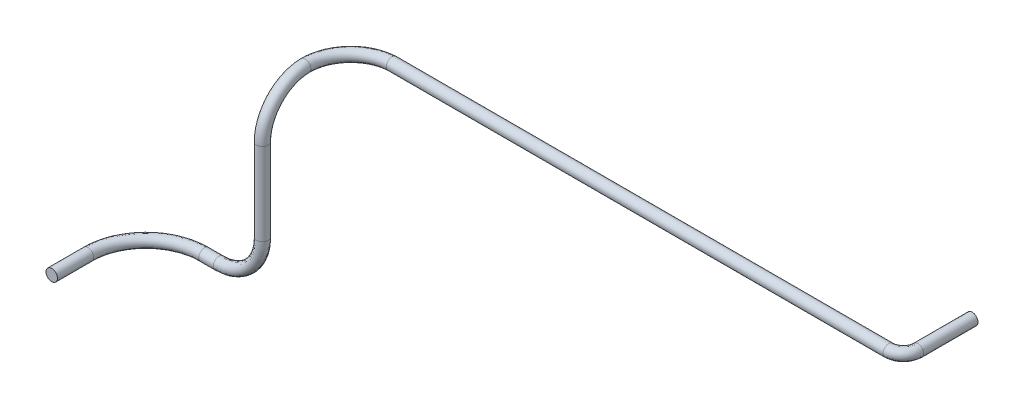
ISO-10303-21;
HEADER;
FILE_DESCRIPTION(('STEP AP214'),'2;1');
FILE_NAME('part.step','',(''),(''),'','','');
FILE_SCHEMA(('AUTOMOTIVE_DESIGN { 1 0 10303 214 1 1 1 1 }'));
ENDSEC;
DATA;
#1=APPLICATION_CONTEXT('core data for automotive mechanical design processes');
#2=APPLICATION_PROTOCOL_DEFINITION('international standard','automotive_design',2000,#1);
#3=PRODUCT_CONTEXT('',#1,'mechanical');
#4=PRODUCT('Part','Part','',(#3));
#5=PRODUCT_RELATED_PRODUCT_CATEGORY('part','',(#4));
#6=PRODUCT_DEFINITION_FORMATION('','',#4);
#7=PRODUCT_DEFINITION_CONTEXT('part definition',#1,'design');
#8=PRODUCT_DEFINITION('design','',#6,#7);
#9=PRODUCT_DEFINITION_SHAPE('','',#8);
#10=(LENGTH_UNIT() NAMED_UNIT(*) SI_UNIT(.MILLI.,.METRE.));
#11=(NAMED_UNIT(*) PLANE_ANGLE_UNIT() SI_UNIT($,.RADIAN.));
#12=(NAMED_UNIT(*) SI_UNIT($,.STERADIAN.) SOLID_ANGLE_UNIT());
#13=UNCERTAINTY_MEASURE_WITH_UNIT(LENGTH_MEASURE(1.E-05),#10,'distance_accuracy_value','');
#14=(GEOMETRIC_REPRESENTATION_CONTEXT(3) GLOBAL_UNCERTAINTY_ASSIGNED_CONTEXT((#13)) GLOBAL_UNIT_ASSIGNED_CONTEXT((#10,
#11,#12)) REPRESENTATION_CONTEXT('',''));
#15=CARTESIAN_POINT('',(0.,0.,0.));
#16=DIRECTION('',(0.,0.,1.));
#17=DIRECTION('',(1.,0.,0.));
#18=AXIS2_PLACEMENT_3D('',#15,#16,#17);
#19=CARTESIAN_POINT('',(15.9022776834919,17.4631518272913,-18.9967218608217));
#20=DIRECTION('',(-0.99953155694736,0.,0.030605010478455));
#21=DIRECTION('',(0.030605010478455,0.,0.99953155694736));
#22=AXIS2_PLACEMENT_3D('',#19,#20,#21);
#23=TOROIDAL_SURFACE('',#22,6.00000000000001,0.793750000000001);
#24=CARTESIAN_POINT('',(16.0859077463626,17.4631518272913,-12.9995325191375));
#25=DIRECTION('',(0.,-1.,0.));
#26=DIRECTION('',(0.,0.,-1.));
#27=AXIS2_PLACEMENT_3D('',#24,#25,#26);
#28=CIRCLE('',#27,0.793750000000001);
#29=CARTESIAN_POINT('',(16.1102004734299,17.4631518272913,-12.2061543458105));
#30=VERTEX_POINT('',#29);
#31=EDGE_CURVE('E85',#30,#30,#28,.T.);
#32=CARTESIAN_POINT('',(15.9003874911531,23.4628339516931,-19.0584538080351));
#33=DIRECTION('',(0.030603389047452,0.010293479778,0.999478602498758));
#34=DIRECTION('',(0.0309055582558082,-0.999478602498758,0.00934717155222445));
#35=AXIS2_PLACEMENT_3D('',#32,#33,#34);
#36=CIRCLE('',#35,0.793750000000001);
#37=CARTESIAN_POINT('',(15.9001374344583,24.2565418994004,-19.0666204302186));
#38=VERTEX_POINT('',#37);
#39=EDGE_CURVE('E91',#38,#38,#36,.T.);
#40=CARTESIAN_POINT('',(15.9022776834919,17.4631518272913,-18.9967218608217));
#41=DIRECTION('',(-0.99953155694736,0.,0.030605010478455));
#42=DIRECTION('',(0.030605010478455,0.,0.99953155694736));
#43=AXIS2_PLACEMENT_3D('',#40,#41,#42);
#44=CIRCLE('',#43,6.79375000000001);
#45=EDGE_CURVE('',#30,#38,#44,.T.);
#46=ORIENTED_EDGE('',*,*,#31,.F.);
#47=ORIENTED_EDGE('',*,*,#39,.T.);
#48=ORIENTED_EDGE('',*,*,#45,.T.);
#49=ORIENTED_EDGE('',*,*,#45,.F.);
#50=EDGE_LOOP('',(#46,#48,#47,#49));
#51=FACE_BOUND('',#50,.T.);
#52=ADVANCED_FACE('F56',(#51),#23,.T.);
#53=CARTESIAN_POINT('',(0.,0.,-5.));
#54=DIRECTION('',(0.,0.,1.));
#55=DIRECTION('',(1.,0.,0.));
#56=AXIS2_PLACEMENT_3D('',#53,#54,#55);
#57=CYLINDRICAL_SURFACE('',#56,0.79375);
#58=CARTESIAN_POINT('',(0.,0.,-5.));
#59=DIRECTION('',(0.,0.,1.));
#60=DIRECTION('',(1.,0.,0.));
#61=AXIS2_PLACEMENT_3D('',#58,#59,#60);
#62=CIRCLE('',#61,0.79375);
#63=CARTESIAN_POINT('',(0.79375,0.,-5.));
#64=VERTEX_POINT('',#63);
#65=EDGE_CURVE('E62',#64,#64,#62,.T.);
#66=ORIENTED_EDGE('',*,*,#65,.T.);
#67=EDGE_LOOP('',(#66));
#68=FACE_BOUND('',#67,.T.);
#69=CARTESIAN_POINT('',(0.,0.,0.));
#70=DIRECTION('',(0.,0.,1.));
#71=DIRECTION('',(1.,0.,0.));
#72=AXIS2_PLACEMENT_3D('',#69,#70,#71);
#73=CIRCLE('',#72,0.79375);
#74=CARTESIAN_POINT('',(0.79375,0.,0.));
#75=VERTEX_POINT('',#74);
#76=EDGE_CURVE('E11',#75,#75,#73,.T.);
#77=ORIENTED_EDGE('',*,*,#76,.F.);
#78=EDGE_LOOP('',(#77));
#79=FACE_BOUND('',#78,.T.);
#80=ADVANCED_FACE('F133',(#68,#79),#57,.T.);
#81=CARTESIAN_POINT('',(0.,0.,0.));
#82=DIRECTION('',(0.,0.,1.));
#83=DIRECTION('',(1.,0.,0.));
#84=AXIS2_PLACEMENT_3D('',#81,#82,#83);
#85=PLANE('',#84);
#86=ORIENTED_EDGE('',*,*,#76,.T.);
#87=EDGE_LOOP('',(#86));
#88=FACE_BOUND('',#87,.T.);
#89=ADVANCED_FACE('F138',(#88),#85,.T.);
#90=CARTESIAN_POINT('',(0.79375,0.,-5.));
#91=CARTESIAN_POINT('',(0.79375,0.,-5.55121069612661));
#92=CARTESIAN_POINT('',(0.902461399918087,0.,-6.49882307808425));
#93=CARTESIAN_POINT('',(1.39506992977593,0.,-8.04076592704354));
#94=CARTESIAN_POINT('',(2.25416291161361,0.,-9.45003486522962));
#95=CARTESIAN_POINT('',(3.34030220407969,0.,-10.5658813927915));
#96=CARTESIAN_POINT('',(4.53595519879204,0.,-11.3600749672463));
#97=CARTESIAN_POINT('',(5.69563502094855,0.,-11.868927939888));
#98=CARTESIAN_POINT('',(6.91816345637884,0.,-12.1531709526249));
#99=CARTESIAN_POINT('',(7.65213138085307,0.,-12.2104319743187));
#100=CARTESIAN_POINT('',(8.08219341902237,0.,-12.2057825191375));
#101=CARTESIAN_POINT('',(0.79375,1.5875,-5.));
#102=CARTESIAN_POINT('',(0.79375,1.5875,-5.71449258598961));
#103=CARTESIAN_POINT('',(0.902496126286649,1.5875,-6.41809205464769));
#104=CARTESIAN_POINT('',(1.3949375966712,1.5875,-8.06402991573264));
#105=CARTESIAN_POINT('',(2.25467999570539,1.5875,-9.44353085862261));
#106=CARTESIAN_POINT('',(3.33852722584472,1.5875,-10.5672313499232));
#107=CARTESIAN_POINT('',(4.54092750105634,1.5875,-11.3597110150834));
#108=CARTESIAN_POINT('',(5.67775924166376,1.5875,-11.8692002777266));
#109=CARTESIAN_POINT('',(6.98062988843737,1.5875,-12.1524746335504));
#110=CARTESIAN_POINT('',(7.5244577637847,1.5875,-12.2118122699684));
#111=CARTESIAN_POINT('',(8.08219341902237,1.5875,-12.2057825191375));
#112=CARTESIAN_POINT('',(-0.79375,1.5875,-5.));
#113=CARTESIAN_POINT('',(-0.79375,1.5875,-5.71449258598961));
#114=CARTESIAN_POINT('',(-0.662564314717088,1.5875,-6.8045773817789));
#115=CARTESIAN_POINT('',(-0.0579898858309135,1.5875,-8.71966285098736));
#116=CARTESIAN_POINT('',(0.981500020508139,1.5875,-10.420512623199));
#117=CARTESIAN_POINT('',(2.31565136931301,1.5875,-11.7941163644912));
#118=CARTESIAN_POINT('',(3.76356797342369,1.5875,-12.7554732375633));
#119=CARTESIAN_POINT('',(5.18003171816228,1.5875,-13.3812237438058));
#120=CARTESIAN_POINT('',(6.68622652073018,1.5875,-13.7270839899256));
#121=CARTESIAN_POINT('',(7.53303884486578,1.5875,-13.7993122699684));
#122=CARTESIAN_POINT('',(8.09077450010345,1.5875,-13.7932825191375));
#123=CARTESIAN_POINT('',(-0.79375,0.,-5.));
#124=CARTESIAN_POINT('',(-0.793750000000001,0.,-5.63285164105811));
#125=CARTESIAN_POINT('',(-0.662581677901369,0.,-6.84494289349718));
#126=CARTESIAN_POINT('',(-0.0579237192785501,0.,-8.70803085664281));
#127=CARTESIAN_POINT('',(0.98124147846225,0.,-10.4237646265025));
#128=CARTESIAN_POINT('',(2.3165388584305,0.,-11.7934413859254));
#129=CARTESIAN_POINT('',(3.76108182229154,0.,-12.7556552136447));
#130=CARTESIAN_POINT('',(5.18896960780467,0.,-13.3810875748865));
#131=CARTESIAN_POINT('',(6.65499330470092,0.,-13.7274321494628));
#132=CARTESIAN_POINT('',(7.59687565339997,0.,-13.7986221221436));
#133=CARTESIAN_POINT('',(8.09077450010345,0.,-13.7932825191375));
#134=CARTESIAN_POINT('',(-0.793750000000001,-1.5875,-5.));
#135=CARTESIAN_POINT('',(-0.793750000000001,-1.5875,-5.55121069612661));
#136=CARTESIAN_POINT('',(-0.662599041085649,-1.5875,-6.88530840521546));
#137=CARTESIAN_POINT('',(-0.0578575527261866,-1.5875,-8.69639886229826));
#138=CARTESIAN_POINT('',(0.98098293641636,-1.5875,-10.427016629806));
#139=CARTESIAN_POINT('',(2.31742634754798,-1.5875,-11.7927664073595));
#140=CARTESIAN_POINT('',(3.75859567115939,-1.5875,-12.7558371897261));
#141=CARTESIAN_POINT('',(5.19790749744705,-1.5875,-13.3809514059672));
#142=CARTESIAN_POINT('',(6.62376008867166,-1.5875,-13.7277803090001));
#143=CARTESIAN_POINT('',(7.66071246193416,-1.5875,-13.7979319743187));
#144=CARTESIAN_POINT('',(8.09077450010345,-1.5875,-13.7932825191375));
#145=CARTESIAN_POINT('',(0.79375,-1.5875,-5.));
#146=CARTESIAN_POINT('',(0.79375,-1.5875,-5.38792880626362));
#147=CARTESIAN_POINT('',(0.902426673549526,-1.5875,-6.5795541015208));
#148=CARTESIAN_POINT('',(1.39520226288065,-1.5875,-8.01750193835444));
#149=CARTESIAN_POINT('',(2.25364582752183,-1.5875,-9.45653887183662));
#150=CARTESIAN_POINT('',(3.34207718231467,-1.5875,-10.5645314356599));
#151=CARTESIAN_POINT('',(4.53098289652774,-1.5875,-11.3604389194091));
#152=CARTESIAN_POINT('',(5.71351080023332,-1.5875,-11.8686556020494));
#153=CARTESIAN_POINT('',(6.85569702432032,-1.5875,-12.1538672716995));
#154=CARTESIAN_POINT('',(7.77980499792145,-1.5875,-12.209051678669));
#155=CARTESIAN_POINT('',(8.08219341902237,-1.5875,-12.2057825191375));
#156=CARTESIAN_POINT('',(0.79375,0.,-5.));
#157=CARTESIAN_POINT('',(0.79375,0.,-5.55121069612661));
#158=CARTESIAN_POINT('',(0.902461399918087,0.,-6.49882307808425));
#159=CARTESIAN_POINT('',(1.39506992977593,0.,-8.04076592704354));
#160=CARTESIAN_POINT('',(2.25416291161361,0.,-9.45003486522962));
#161=CARTESIAN_POINT('',(3.34030220407969,0.,-10.5658813927915));
#162=CARTESIAN_POINT('',(4.53595519879204,0.,-11.3600749672463));
#163=CARTESIAN_POINT('',(5.69563502094855,0.,-11.868927939888));
#164=CARTESIAN_POINT('',(6.91816345637884,0.,-12.1531709526249));
#165=CARTESIAN_POINT('',(7.65213138085307,0.,-12.2104319743187));
#166=CARTESIAN_POINT('',(8.08219341902237,0.,-12.2057825191375));
#167=(BOUNDED_SURFACE() B_SPLINE_SURFACE(3,3,((#90,#91,#92,#93,#94,#95,#96,#97,#98,#99,#100),
(#101,#102,#103,#104,#105,#106,#107,#108,#109,#110,#111),(#112,#113,#114,#115,#116,#117,#118,
#119,#120,#121,#122),(#123,#124,#125,#126,#127,#128,#129,#130,#131,#132,#133),(#134,#135,#136,
#137,#138,#139,#140,#141,#142,#143,#144),(#145,#146,#147,#148,#149,#150,#151,#152,#153,#154,
#155),(#156,#157,#158,#159,#160,#161,#162,#163,#164,#165,#166)),.UNSPECIFIED.,.T.,.F.,
.F.) B_SPLINE_SURFACE_WITH_KNOTS((4,3,4),(4,1,1,1,1,1,1,1,4),(0.,0.5,1.),(0.,0.130931855275869,
0.270275933054755,0.415607398335897,0.563033208375599,0.678069485534592,0.790201692771163,
0.897842426149174,1.),
.UNSPECIFIED.) GEOMETRIC_REPRESENTATION_ITEM() RATIONAL_B_SPLINE_SURFACE(((1.,1.,1.,1.,1.,1.,1.,
1.,1.,1.,1.),(0.333333333333333,0.333333333333333,0.333333333333333,0.333333333333333,
0.333333333333333,0.333333333333334,0.333333333333333,0.333333333333333,0.333333333333333,
0.333333333333333,0.333333333333333),(0.333333333333333,0.333333333333333,0.333333333333333,
0.333333333333333,0.333333333333333,0.333333333333334,0.333333333333333,0.333333333333333,
0.333333333333333,0.333333333333333,0.333333333333333),(1.,1.,1.,1.,1.,1.,1.,1.,1.,1.,1.),
(0.333333333333333,0.333333333333333,0.333333333333333,0.333333333333333,0.333333333333333,
0.333333333333334,0.333333333333333,0.333333333333333,0.333333333333333,0.333333333333333,
0.333333333333333),(0.333333333333333,0.333333333333333,0.333333333333333,0.333333333333333,
0.333333333333333,0.333333333333334,0.333333333333333,0.333333333333333,0.333333333333333,
0.333333333333333,0.333333333333333),(1.,1.,1.,1.,1.,1.,1.,1.,1.,1.,1.))) REPRESENTATION_ITEM('') SURFACE());
#168=CARTESIAN_POINT('',(8.08219341902237,0.,-12.2057825191375));
#169=CARTESIAN_POINT('',(8.08219341902237,1.5875,-12.2057825191375));
#170=CARTESIAN_POINT('',(8.09077450010345,1.5875,-13.7932825191375));
#171=CARTESIAN_POINT('',(8.09077450010345,0.,-13.7932825191375));
#172=CARTESIAN_POINT('',(8.09077450010345,-1.5875,-13.7932825191375));
#173=CARTESIAN_POINT('',(8.08219341902237,-1.5875,-12.2057825191375));
#174=CARTESIAN_POINT('',(8.08219341902237,0.,-12.2057825191375));
#175=(BOUNDED_CURVE() B_SPLINE_CURVE(3,(#168,#169,#170,#171,#172,#173,#174),.UNSPECIFIED.,.T.,
.F.) B_SPLINE_CURVE_WITH_KNOTS((4,3,4),(0.,0.5,1.),
.UNSPECIFIED.) CURVE() GEOMETRIC_REPRESENTATION_ITEM() RATIONAL_B_SPLINE_CURVE((1.,
0.333333333333333,0.333333333333333,1.,0.333333333333333,0.333333333333333,1.)) REPRESENTATION_ITEM(''));
#176=CARTESIAN_POINT('',(8.08219341902237,0.,-12.2057825191375));
#177=VERTEX_POINT('',#176);
#178=EDGE_CURVE('E66',#177,#177,#175,.F.);
#179=ORIENTED_EDGE('',*,*,#65,.F.);
#180=EDGE_LOOP('',(#179));
#181=FACE_BOUND('',#180,.T.);
#182=ORIENTED_EDGE('',*,*,#178,.F.);
#183=EDGE_LOOP('',(#182));
#184=FACE_BOUND('',#183,.T.);
#185=ADVANCED_FACE('F201',(#181,#184),#167,.F.);
#186=CARTESIAN_POINT('',(8.08219341902237,0.,-12.2057825191375));
#187=CARTESIAN_POINT('',(10.0864839595629,0.,-12.2057825191375));
#188=CARTESIAN_POINT('',(8.08219341902237,-1.5875,-12.2057825191375));
#189=CARTESIAN_POINT('',(10.0864839595629,-1.5875,-12.2057825191375));
#190=CARTESIAN_POINT('',(8.09077450010345,-1.5875,-13.7932825191375));
#191=CARTESIAN_POINT('',(10.0864839595629,-1.5875,-13.7932825191375));
#192=CARTESIAN_POINT('',(8.09077450010345,0.,-13.7932825191375));
#193=CARTESIAN_POINT('',(10.0864839595629,0.,-13.7932825191375));
#194=CARTESIAN_POINT('',(8.09077450010345,1.5875,-13.7932825191375));
#195=CARTESIAN_POINT('',(10.0864839595629,1.5875,-13.7932825191375));
#196=CARTESIAN_POINT('',(8.08219341902237,1.5875,-12.2057825191375));
#197=CARTESIAN_POINT('',(10.0864839595629,1.5875,-12.2057825191375));
#198=CARTESIAN_POINT('',(8.08219341902237,0.,-12.2057825191375));
#199=CARTESIAN_POINT('',(10.0864839595629,0.,-12.2057825191375));
#200=(BOUNDED_SURFACE() B_SPLINE_SURFACE(3,1,((#186,#187),(#188,#189),(#190,#191),(#192,#193),
(#194,#195),(#196,#197),(#198,#199)),.UNSPECIFIED.,.T.,.F.,.F.) B_SPLINE_SURFACE_WITH_KNOTS((4,
3,4),(2,2),(0.,0.5,1.),(0.,1.),
.UNSPECIFIED.) GEOMETRIC_REPRESENTATION_ITEM() RATIONAL_B_SPLINE_SURFACE(((1.,1.),
(0.333333333333333,0.333333333333333),(0.333333333333333,0.333333333333333),(1.,1.),
(0.333333333333333,0.333333333333333),(0.333333333333333,0.333333333333333),(1.,1.))) REPRESENTATION_ITEM('') SURFACE());
#201=CARTESIAN_POINT('',(10.0864839595629,0.,-12.9995325191375));
#202=DIRECTION('',(-1.,0.,0.));
#203=DIRECTION('',(0.,0.,1.));
#204=AXIS2_PLACEMENT_3D('',#201,#202,#203);
#205=CIRCLE('',#204,0.793750000000001);
#206=CARTESIAN_POINT('',(10.0864839595629,0.,-12.2057825191375));
#207=VERTEX_POINT('',#206);
#208=EDGE_CURVE('E70',#207,#207,#205,.T.);
#209=ORIENTED_EDGE('',*,*,#178,.T.);
#210=EDGE_LOOP('',(#209));
#211=FACE_BOUND('',#210,.T.);
#212=ORIENTED_EDGE('',*,*,#208,.T.);
#213=EDGE_LOOP('',(#212));
#214=FACE_BOUND('',#213,.T.);
#215=ADVANCED_FACE('F190',(#211,#214),#200,.T.);
#216=CARTESIAN_POINT('',(10.0864839595629,0.,-12.2057825191375));
#217=CARTESIAN_POINT('',(10.4156071673363,0.,-12.2057825191375));
#218=CARTESIAN_POINT('',(11.092904952409,0.0572010557845806,-12.2057825191375));
#219=CARTESIAN_POINT('',(12.1035801235411,0.315056429532537,-12.2057825191375));
#220=CARTESIAN_POINT('',(13.0899866308757,0.76888029284049,-12.2057825191375));
#221=CARTESIAN_POINT('',(14.0011565230001,1.40742482158729,-12.2057825191375));
#222=CARTESIAN_POINT('',(14.7787276954148,2.20690643633673,-12.2057825191375));
#223=CARTESIAN_POINT('',(15.386385076463,3.12183933203862,-12.2057825191375));
#224=CARTESIAN_POINT('',(15.8099007232931,4.09892911030999,-12.2057825191375));
#225=CARTESIAN_POINT('',(16.0444876780903,5.09479114986662,-12.2057825191375));
#226=CARTESIAN_POINT('',(16.0903853294223,5.7600931623081,-12.2057825191375));
#227=CARTESIAN_POINT('',(16.0859077463626,6.08315182729134,-12.2057825191375));
#228=CARTESIAN_POINT('',(10.0864839595629,1.5875,-12.2057825191375));
#229=CARTESIAN_POINT('',(10.4156071673363,1.5875,-12.2057825191375));
#230=CARTESIAN_POINT('',(10.7840771907375,1.62961991510903,-12.2057825191375));
#231=CARTESIAN_POINT('',(11.5873219733214,1.82111491024618,-12.2057825191374));
#232=CARTESIAN_POINT('',(12.2904850075255,2.15222558219324,-12.2057825191375));
#233=CARTESIAN_POINT('',(12.9752077745897,2.63047691940933,-12.2057825191374));
#234=CARTESIAN_POINT('',(13.5364207042263,3.20910700574488,-12.2057825191375));
#235=CARTESIAN_POINT('',(13.99030672049,3.89816121286266,-12.2057825191375));
#236=CARTESIAN_POINT('',(14.2971994566224,4.59493017412421,-12.2057825191374));
#237=CARTESIAN_POINT('',(14.4694720208952,5.38712763926278,-12.2057825191375));
#238=CARTESIAN_POINT('',(14.5028853294223,5.74909234025445,-12.2057825191375));
#239=CARTESIAN_POINT('',(14.4984077463626,6.07215100523768,-12.2057825191375));
#240=CARTESIAN_POINT('',(10.0864839595629,1.5875,-13.7932825191375));
#241=CARTESIAN_POINT('',(10.4156071673363,1.5875,-13.7932825191375));
#242=CARTESIAN_POINT('',(10.7840771907375,1.629619915109,-13.7932825191375));
#243=CARTESIAN_POINT('',(11.5873219733213,1.82111491024629,-13.7932825191374));
#244=CARTESIAN_POINT('',(12.2904850075255,2.1522255821932,-13.7932825191375));
#245=CARTESIAN_POINT('',(12.9752077745897,2.63047691940937,-13.7932825191374));
#246=CARTESIAN_POINT('',(13.5364207042263,3.20910700574487,-13.7932825191375));
#247=CARTESIAN_POINT('',(13.99030672049,3.89816121286266,-13.7932825191375));
#248=CARTESIAN_POINT('',(14.2971994566223,4.59493017412423,-13.7932825191374));
#249=CARTESIAN_POINT('',(14.4694720208952,5.38712763926278,-13.7932825191375));
#250=CARTESIAN_POINT('',(14.5028853294223,5.74909234025445,-13.7932825191375));
#251=CARTESIAN_POINT('',(14.4984077463626,6.07215100523768,-13.7932825191375));
#252=CARTESIAN_POINT('',(10.0864839595629,0.,-13.7932825191375));
#253=CARTESIAN_POINT('',(10.4156071673363,0.,-13.7932825191375));
#254=CARTESIAN_POINT('',(11.092904952409,0.0572010557845516,-13.7932825191375));
#255=CARTESIAN_POINT('',(12.103580123541,0.315056429532647,-13.7932825191375));
#256=CARTESIAN_POINT('',(13.0899866308757,0.768880292840451,-13.7932825191375));
#257=CARTESIAN_POINT('',(14.0011565230001,1.40742482158733,-13.7932825191375));
#258=CARTESIAN_POINT('',(14.7787276954148,2.20690643633672,-13.7932825191375));
#259=CARTESIAN_POINT('',(15.386385076463,3.12183933203862,-13.7932825191375));
#260=CARTESIAN_POINT('',(15.8099007232931,4.09892911031001,-13.7932825191375));
#261=CARTESIAN_POINT('',(16.0444876780904,5.09479114986661,-13.7932825191375));
#262=CARTESIAN_POINT('',(16.0903853294223,5.7600931623081,-13.7932825191375));
#263=CARTESIAN_POINT('',(16.0859077463626,6.08315182729134,-13.7932825191375));
#264=CARTESIAN_POINT('',(10.0864839595629,-1.5875,-13.7932825191375));
#265=CARTESIAN_POINT('',(10.4156071673363,-1.5875,-13.7932825191375));
#266=CARTESIAN_POINT('',(11.4017327140805,-1.5152178035399,-13.7932825191375));
#267=CARTESIAN_POINT('',(12.6198382737607,-1.191002051181,-13.7932825191376));
#268=CARTESIAN_POINT('',(13.8894882542258,-0.614464996512293,-13.7932825191375));
#269=CARTESIAN_POINT('',(15.0271052714105,0.184372723765301,-13.7932825191375));
#270=CARTESIAN_POINT('',(16.0210346866033,1.20470586692857,-13.7932825191375));
#271=CARTESIAN_POINT('',(16.782463432436,2.34551745121458,-13.7932825191375));
#272=CARTESIAN_POINT('',(17.3226019899638,3.60292804649579,-13.7932825191376));
#273=CARTESIAN_POINT('',(17.6195033352855,4.80245466047045,-13.7932825191375));
#274=CARTESIAN_POINT('',(17.6778853294223,5.77109398436176,-13.7932825191375));
#275=CARTESIAN_POINT('',(17.6734077463626,6.09415264934499,-13.7932825191375));
#276=CARTESIAN_POINT('',(10.0864839595629,-1.5875,-12.2057825191375));
#277=CARTESIAN_POINT('',(10.4156071673363,-1.5875,-12.2057825191375));
#278=CARTESIAN_POINT('',(11.4017327140805,-1.51521780353987,-12.2057825191375));
#279=CARTESIAN_POINT('',(12.6198382737608,-1.19100205118111,-12.2057825191376));
#280=CARTESIAN_POINT('',(13.8894882542258,-0.614464996512254,-12.2057825191374));
#281=CARTESIAN_POINT('',(15.0271052714106,0.184372723765259,-12.2057825191375));
#282=CARTESIAN_POINT('',(16.0210346866033,1.20470586692857,-12.2057825191375));
#283=CARTESIAN_POINT('',(16.782463432436,2.34551745121458,-12.2057825191375));
#284=CARTESIAN_POINT('',(17.3226019899639,3.60292804649577,-12.2057825191376));
#285=CARTESIAN_POINT('',(17.6195033352855,4.80245466047045,-12.2057825191375));
#286=CARTESIAN_POINT('',(17.6778853294223,5.77109398436176,-12.2057825191375));
#287=CARTESIAN_POINT('',(17.6734077463626,6.09415264934499,-12.2057825191375));
#288=CARTESIAN_POINT('',(10.0864839595629,0.,-12.2057825191375));
#289=CARTESIAN_POINT('',(10.4156071673363,0.,-12.2057825191375));
#290=CARTESIAN_POINT('',(11.092904952409,0.0572010557845806,-12.2057825191375));
#291=CARTESIAN_POINT('',(12.1035801235411,0.315056429532537,-12.2057825191375));
#292=CARTESIAN_POINT('',(13.0899866308757,0.76888029284049,-12.2057825191375));
#293=CARTESIAN_POINT('',(14.0011565230001,1.40742482158729,-12.2057825191375));
#294=CARTESIAN_POINT('',(14.7787276954148,2.20690643633673,-12.2057825191375));
#295=CARTESIAN_POINT('',(15.386385076463,3.12183933203862,-12.2057825191375));
#296=CARTESIAN_POINT('',(15.8099007232931,4.09892911030999,-12.2057825191375));
#297=CARTESIAN_POINT('',(16.0444876780903,5.09479114986662,-12.2057825191375));
#298=CARTESIAN_POINT('',(16.0903853294223,5.7600931623081,-12.2057825191375));
#299=CARTESIAN_POINT('',(16.0859077463626,6.08315182729134,-12.2057825191375));
#300=(BOUNDED_SURFACE() B_SPLINE_SURFACE(3,3,((#216,#217,#218,#219,#220,#221,#222,#223,#224,
#225,#226,#227),(#228,#229,#230,#231,#232,#233,#234,#235,#236,#237,#238,#239),(#240,#241,#242,
#243,#244,#245,#246,#247,#248,#249,#250,#251),(#252,#253,#254,#255,#256,#257,#258,#259,#260,
#261,#262,#263),(#264,#265,#266,#267,#268,#269,#270,#271,#272,#273,#274,#275),(#276,#277,#278,
#279,#280,#281,#282,#283,#284,#285,#286,#287),(#288,#289,#290,#291,#292,#293,#294,#295,#296,
#297,#298,#299)),.UNSPECIFIED.,.T.,.F.,.F.) B_SPLINE_SURFACE_WITH_KNOTS((4,3,4),(4,1,1,1,1,1,1,
1,1,4),(0.,0.5,1.),(0.,0.103991589107504,0.213654385410186,0.327971845338527,0.445153856531877,
0.563248175135867,0.678229257362202,0.790339538006728,0.897914717250648,1.),
.UNSPECIFIED.) GEOMETRIC_REPRESENTATION_ITEM() RATIONAL_B_SPLINE_SURFACE(((1.,1.,1.,1.,1.,1.,1.,
1.,1.,1.,1.,1.),(0.333333333333333,0.333333333333333,0.333333333333333,0.333333333333333,
0.333333333333333,0.333333333333333,0.333333333333333,0.333333333333333,0.333333333333333,
0.333333333333333,0.333333333333333,0.333333333333333),(0.333333333333333,0.333333333333333,
0.333333333333333,0.333333333333333,0.333333333333333,0.333333333333333,0.333333333333333,
0.333333333333333,0.333333333333333,0.333333333333333,0.333333333333333,0.333333333333333),(1.,
1.,1.,1.,1.,1.,1.,1.,1.,1.,1.,1.),(0.333333333333333,0.333333333333333,0.333333333333333,
0.333333333333333,0.333333333333333,0.333333333333333,0.333333333333333,0.333333333333333,
0.333333333333333,0.333333333333333,0.333333333333333,0.333333333333333),(0.333333333333333,
0.333333333333333,0.333333333333333,0.333333333333333,0.333333333333333,0.333333333333333,
0.333333333333333,0.333333333333333,0.333333333333333,0.333333333333333,0.333333333333333,
0.333333333333333),(1.,1.,1.,1.,1.,1.,1.,1.,1.,1.,1.,1.))) REPRESENTATION_ITEM('') SURFACE());
#301=CARTESIAN_POINT('',(16.0859077463626,6.08315182729134,-12.2057825191375));
#302=CARTESIAN_POINT('',(14.4984077463626,6.07215100523768,-12.2057825191375));
#303=CARTESIAN_POINT('',(14.4984077463626,6.07215100523768,-13.7932825191375));
#304=CARTESIAN_POINT('',(16.0859077463626,6.08315182729134,-13.7932825191375));
#305=CARTESIAN_POINT('',(17.6734077463626,6.09415264934499,-13.7932825191375));
#306=CARTESIAN_POINT('',(17.6734077463626,6.09415264934499,-12.2057825191375));
#307=CARTESIAN_POINT('',(16.0859077463626,6.08315182729134,-12.2057825191375));
#308=(BOUNDED_CURVE() B_SPLINE_CURVE(3,(#301,#302,#303,#304,#305,#306,#307),.UNSPECIFIED.,.T.,
.F.) B_SPLINE_CURVE_WITH_KNOTS((4,3,4),(0.,0.5,1.),
.UNSPECIFIED.) CURVE() GEOMETRIC_REPRESENTATION_ITEM() RATIONAL_B_SPLINE_CURVE((1.,
0.333333333333333,0.333333333333333,1.,0.333333333333333,0.333333333333333,1.)) REPRESENTATION_ITEM(''));
#309=CARTESIAN_POINT('',(16.0859077463626,6.08315182729134,-12.2057825191375));
#310=VERTEX_POINT('',#309);
#311=EDGE_CURVE('E80',#310,#310,#308,.F.);
#312=ORIENTED_EDGE('',*,*,#208,.F.);
#313=EDGE_LOOP('',(#312));
#314=FACE_BOUND('',#313,.T.);
#315=ORIENTED_EDGE('',*,*,#311,.F.);
#316=EDGE_LOOP('',(#315));
#317=FACE_BOUND('',#316,.T.);
#318=ADVANCED_FACE('F179',(#314,#317),#300,.F.);
#319=CARTESIAN_POINT('',(16.0859077463626,6.08315182729134,-12.2057825191375));
#320=CARTESIAN_POINT('',(16.0859077463626,17.4631518272913,-12.2057825191375));
#321=CARTESIAN_POINT('',(17.6734077463626,6.09415264934499,-12.2057825191375));
#322=CARTESIAN_POINT('',(17.6734077463626,17.4631518272913,-12.2057825191375));
#323=CARTESIAN_POINT('',(17.6734077463626,6.09415264934499,-13.7932825191375));
#324=CARTESIAN_POINT('',(17.6734077463626,17.4631518272913,-13.7932825191375));
#325=CARTESIAN_POINT('',(16.0859077463626,6.08315182729134,-13.7932825191375));
#326=CARTESIAN_POINT('',(16.0859077463626,17.4631518272913,-13.7932825191375));
#327=CARTESIAN_POINT('',(14.4984077463626,6.07215100523768,-13.7932825191375));
#328=CARTESIAN_POINT('',(14.4984077463626,17.4631518272913,-13.7932825191375));
#329=CARTESIAN_POINT('',(14.4984077463626,6.07215100523768,-12.2057825191375));
#330=CARTESIAN_POINT('',(14.4984077463626,17.4631518272913,-12.2057825191375));
#331=CARTESIAN_POINT('',(16.0859077463626,6.08315182729134,-12.2057825191375));
#332=CARTESIAN_POINT('',(16.0859077463626,17.4631518272913,-12.2057825191375));
#333=(BOUNDED_SURFACE() B_SPLINE_SURFACE(3,1,((#319,#320),(#321,#322),(#323,#324),(#325,#326),
(#327,#328),(#329,#330),(#331,#332)),.UNSPECIFIED.,.T.,.F.,.F.) B_SPLINE_SURFACE_WITH_KNOTS((4,
3,4),(2,2),(0.,0.5,1.),(0.,1.),
.UNSPECIFIED.) GEOMETRIC_REPRESENTATION_ITEM() RATIONAL_B_SPLINE_SURFACE(((1.,1.),
(0.333333333333333,0.333333333333333),(0.333333333333333,0.333333333333333),(1.,1.),
(0.333333333333333,0.333333333333333),(0.333333333333333,0.333333333333333),(1.,1.))) REPRESENTATION_ITEM('') SURFACE());
#334=ORIENTED_EDGE('',*,*,#311,.T.);
#335=EDGE_LOOP('',(#334));
#336=FACE_BOUND('',#335,.T.);
#337=ORIENTED_EDGE('',*,*,#31,.T.);
#338=EDGE_LOOP('',(#337));
#339=FACE_BOUND('',#338,.T.);
#340=ADVANCED_FACE('F146',(#336,#339),#333,.T.);
#341=CARTESIAN_POINT('',(15.9249187780186,22.6694978109597,-19.0510344906155));
#342=CARTESIAN_POINT('',(15.9123074001239,22.6652559616949,-19.4629105195837));
#343=CARTESIAN_POINT('',(15.9753648527662,22.6587873584817,-20.3155489036407));
#344=CARTESIAN_POINT('',(16.3441238672302,22.6563448642548,-21.5787863486613));
#345=CARTESIAN_POINT('',(17.0128990089931,22.6623397432432,-22.7729946284047));
#346=CARTESIAN_POINT('',(17.8831822038274,22.6758310091782,-23.7283696901541));
#347=CARTESIAN_POINT('',(18.8427184898837,22.6941602165956,-24.418291105192));
#348=CARTESIAN_POINT('',(19.7949138855259,22.7145061436134,-24.8759996034077));
#349=CARTESIAN_POINT('',(20.7735976102355,22.7373060538036,-25.1478024916096));
#350=CARTESIAN_POINT('',(21.4305643035122,22.7536474466346,-25.2212200850917));
#351=CARTESIAN_POINT('',(21.751904748704,22.761902570363,-25.2295548289814));
#352=CARTESIAN_POINT('',(17.5109165137102,22.7180806910726,-19.1000970643466));
#353=CARTESIAN_POINT('',(17.4982408737101,22.7138172271859,-19.5140718347032));
#354=CARTESIAN_POINT('',(17.5504975583229,22.7108057612913,-19.9735081460467));
#355=CARTESIAN_POINT('',(17.8140071658628,22.7082225066481,-20.9643533241682));
#356=CARTESIAN_POINT('',(18.3105636736513,22.7128762160697,-21.8297218311341));
#357=CARTESIAN_POINT('',(18.936244355476,22.722466890822,-22.5280174500001));
#358=CARTESIAN_POINT('',(19.652016637039,22.7361544255634,-23.0411175211869));
#359=CARTESIAN_POINT('',(20.3248039596233,22.7504272860977,-23.3753385916913));
#360=CARTESIAN_POINT('',(21.1006846028789,22.7686111536952,-23.579396660874));
#361=CARTESIAN_POINT('',(21.448917140074,22.7771254639618,-23.633844540326));
#362=CARTESIAN_POINT('',(21.7721813598536,22.7854300087871,-23.642229181976));
#363=CARTESIAN_POINT('',(17.4618539399791,24.3047529725393,-19.1149356991858));
#364=CARTESIAN_POINT('',(17.4491782999791,24.3004895086526,-19.5289104695424));
#365=CARTESIAN_POINT('',(17.5017714311548,24.297438767623,-19.9933970476155));
#366=CARTESIAN_POINT('',(17.7673891458188,24.2948815021371,-20.9872604254181));
#367=CARTESIAN_POINT('',(18.2673673675154,24.2995914864803,-21.8560452692922));
#368=CARTESIAN_POINT('',(18.8971769094143,24.3092751944357,-22.5558194877683));
#369=CARTESIAN_POINT('',(19.6178144953243,24.3230798316654,-23.0698753924479));
#370=CARTESIAN_POINT('',(20.2955599608483,24.3374890227194,-23.4032826296241));
#371=CARTESIAN_POINT('',(21.0751250144523,24.3557775742385,-23.6063807107368));
#372=CARTESIAN_POINT('',(21.4282299891206,24.3644511109672,-23.65737197875));
#373=CARTESIAN_POINT('',(21.7514942089003,24.3727556557925,-23.6657566204));
#374=CARTESIAN_POINT('',(15.8758562042875,24.2561700924265,-19.0658731254547));
#375=CARTESIAN_POINT('',(15.8632126953401,24.2519174358507,-19.478798525117));
#376=CARTESIAN_POINT('',(15.9266548687423,24.2454257133144,-20.3349191345295));
#377=CARTESIAN_POINT('',(16.2975002783868,24.2430022961522,-21.6018427611028));
#378=CARTESIAN_POINT('',(16.9697078706481,24.249055543247,-22.7992764492167));
#379=CARTESIAN_POINT('',(17.8441011400095,24.2626388817208,-23.7561799216141));
#380=CARTESIAN_POINT('',(18.8085538167884,24.2810866041976,-24.4470479551322));
#381=CARTESIAN_POINT('',(19.7655352947615,24.3015644177828,-24.9039406586626));
#382=CARTESIAN_POINT('',(20.7485084187863,24.3244845599637,-25.1747986073956));
#383=CARTESIAN_POINT('',(21.4089152652649,24.3409483830916,-25.2447225746356));
#384=CARTESIAN_POINT('',(21.7312175977506,24.3492282173685,-25.2530822674054));
#385=CARTESIAN_POINT('',(14.289858468596,24.2075872123137,-19.0168105517236));
#386=CARTESIAN_POINT('',(14.2772470907012,24.2033453630488,-19.4286865806917));
#387=CARTESIAN_POINT('',(14.3515383063298,24.1934126590057,-20.6764412214435));
#388=CARTESIAN_POINT('',(14.8276114109547,24.1911230901674,-22.2164250967874));
#389=CARTESIAN_POINT('',(15.6720483737807,24.1985196000136,-23.7425076291413));
#390=CARTESIAN_POINT('',(16.7910253706047,24.2160025690058,-24.9565403554599));
#391=CARTESIAN_POINT('',(17.9992931382524,24.2390933767299,-25.8242205178166));
#392=CARTESIAN_POINT('',(19.2355106286748,24.2656398128462,-26.4045986877012));
#393=CARTESIAN_POINT('',(20.4218918231202,24.2931915456888,-26.7432165040544));
#394=CARTESIAN_POINT('',(21.3896005414092,24.317445655216,-26.8320731705211));
#395=CARTESIAN_POINT('',(21.710940986601,24.3257007789445,-26.8404079144109));
#396=CARTESIAN_POINT('',(14.3389210423271,22.6209149308469,-19.0019719168845));
#397=CARTESIAN_POINT('',(14.3263739265376,22.6166946962039,-19.4117492044641));
#398=CARTESIAN_POINT('',(14.4002321472095,22.6067689556721,-20.6575896612348));
#399=CARTESIAN_POINT('',(14.8742405685976,22.6044672218614,-22.1932193731544));
#400=CARTESIAN_POINT('',(15.7152343443349,22.6118032704167,-23.7162674256753));
#401=CARTESIAN_POINT('',(16.8301200521787,22.6291951275343,-24.928721930308));
#402=CARTESIAN_POINT('',(18.0334203427284,22.6521660076277,-25.7954646891972));
#403=CARTESIAN_POINT('',(19.2650238114286,22.6785850011291,-26.3766606151241));
#404=CARTESIAN_POINT('',(20.446510617592,22.7060009539121,-26.7162083223451));
#405=CARTESIAN_POINT('',(21.4122114669504,22.7301694293074,-26.8085956298574));
#406=CARTESIAN_POINT('',(21.7316281375544,22.738375131939,-26.8168804759869));
#407=CARTESIAN_POINT('',(15.9249187780186,22.6694978109597,-19.0510344906155));
#408=CARTESIAN_POINT('',(15.9123074001239,22.6652559616949,-19.4629105195837));
#409=CARTESIAN_POINT('',(15.9753648527662,22.6587873584817,-20.3155489036407));
#410=CARTESIAN_POINT('',(16.3441238672302,22.6563448642548,-21.5787863486613));
#411=CARTESIAN_POINT('',(17.0128990089931,22.6623397432432,-22.7729946284047));
#412=CARTESIAN_POINT('',(17.8831822038274,22.6758310091782,-23.7283696901541));
#413=CARTESIAN_POINT('',(18.8427184898837,22.6941602165956,-24.418291105192));
#414=CARTESIAN_POINT('',(19.7949138855259,22.7145061436134,-24.8759996034077));
#415=CARTESIAN_POINT('',(20.7735976102355,22.7373060538036,-25.1478024916096));
#416=CARTESIAN_POINT('',(21.4305643035122,22.7536474466346,-25.2212200850917));
#417=CARTESIAN_POINT('',(21.751904748704,22.761902570363,-25.2295548289814));
#418=(BOUNDED_SURFACE() B_SPLINE_SURFACE(3,3,((#341,#342,#343,#344,#345,#346,#347,#348,#349,
#350,#351),(#352,#353,#354,#355,#356,#357,#358,#359,#360,#361,#362),(#363,#364,#365,#366,#367,
#368,#369,#370,#371,#372,#373),(#374,#375,#376,#377,#378,#379,#380,#381,#382,#383,#384),(#385,
#386,#387,#388,#389,#390,#391,#392,#393,#394,#395),(#396,#397,#398,#399,#400,#401,#402,#403,
#404,#405,#406),(#407,#408,#409,#410,#411,#412,#413,#414,#415,#416,#417)),.UNSPECIFIED.,.T.,.F.,
.F.) B_SPLINE_SURFACE_WITH_KNOTS((4,3,4),(4,1,1,1,1,1,1,1,4),(0.,0.5,1.),(0.,0.130996990791339,
0.270366826360009,0.415637501797421,0.563035931322771,0.678005537451252,0.790138104229313,
0.897787039621126,1.),
.UNSPECIFIED.) GEOMETRIC_REPRESENTATION_ITEM() RATIONAL_B_SPLINE_SURFACE(((1.,1.,1.,1.,1.,1.,1.,
1.,1.,1.,1.),(0.333333333333333,0.333333333333333,0.333333333333333,0.333333333333333,
0.333333333333333,0.333333333333333,0.333333333333333,0.333333333333333,0.333333333333333,
0.333333333333333,0.333333333333333),(0.333333333333333,0.333333333333333,0.333333333333333,
0.333333333333333,0.333333333333333,0.333333333333333,0.333333333333333,0.333333333333333,
0.333333333333333,0.333333333333333,0.333333333333333),(1.,1.,1.,1.,1.,1.,1.,1.,1.,1.,1.),
(0.333333333333333,0.333333333333333,0.333333333333333,0.333333333333333,0.333333333333333,
0.333333333333333,0.333333333333333,0.333333333333333,0.333333333333333,0.333333333333333,
0.333333333333333),(0.333333333333333,0.333333333333333,0.333333333333333,0.333333333333333,
0.333333333333333,0.333333333333333,0.333333333333333,0.333333333333333,0.333333333333333,
0.333333333333333,0.333333333333333),(1.,1.,1.,1.,1.,1.,1.,1.,1.,1.,1.))) REPRESENTATION_ITEM('') SURFACE());
#419=CARTESIAN_POINT('',(21.751904748704,22.761902570363,-25.2295548289814));
#420=CARTESIAN_POINT('',(21.7721813598536,22.7854300087871,-23.642229181976));
#421=CARTESIAN_POINT('',(21.7514942089003,24.3727556557925,-23.6657566204));
#422=CARTESIAN_POINT('',(21.7312175977506,24.3492282173685,-25.2530822674054));
#423=CARTESIAN_POINT('',(21.710940986601,24.3257007789445,-26.8404079144109));
#424=CARTESIAN_POINT('',(21.7316281375544,22.738375131939,-26.8168804759869));
#425=CARTESIAN_POINT('',(21.751904748704,22.761902570363,-25.2295548289814));
#426=(BOUNDED_CURVE() B_SPLINE_CURVE(3,(#419,#420,#421,#422,#423,#424,#425),.UNSPECIFIED.,.T.,
.F.) B_SPLINE_CURVE_WITH_KNOTS((4,3,4),(0.,0.5,1.),
.UNSPECIFIED.) CURVE() GEOMETRIC_REPRESENTATION_ITEM() RATIONAL_B_SPLINE_CURVE((1.,
0.333333333333333,0.333333333333333,1.,0.333333333333333,0.333333333333333,1.)) REPRESENTATION_ITEM(''));
#427=CARTESIAN_POINT('',(21.751904748704,22.761902570363,-25.2295548289814));
#428=VERTEX_POINT('',#427);
#429=EDGE_CURVE('E94',#428,#428,#426,.F.);
#430=ORIENTED_EDGE('',*,*,#39,.F.);
#431=EDGE_LOOP('',(#430));
#432=FACE_BOUND('',#431,.T.);
#433=ORIENTED_EDGE('',*,*,#429,.F.);
#434=EDGE_LOOP('',(#433));
#435=FACE_BOUND('',#434,.T.);
#436=ADVANCED_FACE('F143',(#432,#435),#418,.F.);
#437=CARTESIAN_POINT('',(21.751904748704,22.761902570363,-25.2295548289814));
#438=CARTESIAN_POINT('',(90.3215611732273,22.7619025703631,-25.2295548289814));
#439=CARTESIAN_POINT('',(21.7316281375544,22.738375131939,-26.8168804759869));
#440=CARTESIAN_POINT('',(90.3215611732273,22.738375131939,-26.8168804759869));
#441=CARTESIAN_POINT('',(21.710940986601,24.3257007789445,-26.8404079144109));
#442=CARTESIAN_POINT('',(90.3215611732273,24.3257007789445,-26.8404079144109));
#443=CARTESIAN_POINT('',(21.7312175977506,24.3492282173685,-25.2530822674054));
#444=CARTESIAN_POINT('',(90.3215611732273,24.3492282173685,-25.2530822674054));
#445=CARTESIAN_POINT('',(21.7514942089003,24.3727556557925,-23.6657566204));
#446=CARTESIAN_POINT('',(90.3215611732273,24.3727556557925,-23.6657566204));
#447=CARTESIAN_POINT('',(21.7721813598536,22.7854300087871,-23.642229181976));
#448=CARTESIAN_POINT('',(90.3215611732273,22.7854300087871,-23.642229181976));
#449=CARTESIAN_POINT('',(21.751904748704,22.761902570363,-25.2295548289814));
#450=CARTESIAN_POINT('',(90.3215611732273,22.7619025703631,-25.2295548289814));
#451=(BOUNDED_SURFACE() B_SPLINE_SURFACE(3,1,((#437,#438),(#439,#440),(#441,#442),(#443,#444),
(#445,#446),(#447,#448),(#449,#450)),.UNSPECIFIED.,.T.,.F.,.F.) B_SPLINE_SURFACE_WITH_KNOTS((4,
3,4),(2,2),(0.,0.5,1.),(0.,1.),
.UNSPECIFIED.) GEOMETRIC_REPRESENTATION_ITEM() RATIONAL_B_SPLINE_SURFACE(((1.,1.),
(0.333333333333333,0.333333333333333),(0.333333333333333,0.333333333333333),(1.,1.),
(0.333333333333333,0.333333333333333),(0.333333333333333,0.333333333333333),(1.,1.))) REPRESENTATION_ITEM('') SURFACE());
#452=CARTESIAN_POINT('',(90.3215611732273,23.5555653938658,-25.2413185481934));
#453=DIRECTION('',(-1.,0.,0.));
#454=DIRECTION('',(0.,0.,1.));
#455=AXIS2_PLACEMENT_3D('',#452,#453,#454);
#456=CIRCLE('',#455,0.79375);
#457=CARTESIAN_POINT('',(90.3215611732273,23.5555653938658,-24.4475685481934));
#458=VERTEX_POINT('',#457);
#459=EDGE_CURVE('E99',#458,#458,#456,.T.);
#460=ORIENTED_EDGE('',*,*,#429,.T.);
#461=EDGE_LOOP('',(#460));
#462=FACE_BOUND('',#461,.T.);
#463=ORIENTED_EDGE('',*,*,#459,.T.);
#464=EDGE_LOOP('',(#463));
#465=FACE_BOUND('',#464,.T.);
#466=ADVANCED_FACE('F129',(#462,#465),#451,.T.);
#467=CARTESIAN_POINT('',(90.3215611732273,23.5555653938658,-24.4475685481934));
#468=CARTESIAN_POINT('',(90.4598993050933,23.5555653938658,-24.4475685481934));
#469=CARTESIAN_POINT('',(90.9533195413462,23.5553086035552,-24.4961024894056));
#470=CARTESIAN_POINT('',(91.4848616204687,23.5542955547999,-24.6875709626987));
#471=CARTESIAN_POINT('',(92.0423508337964,23.5526074078156,-25.0066345064048));
#472=CARTESIAN_POINT('',(92.4835854740585,23.5503147996332,-25.4399425641972));
#473=CARTESIAN_POINT('',(92.784118155584,23.5478853856939,-25.8991072150149));
#474=CARTESIAN_POINT('',(92.9759082380774,23.5454853102026,-26.3527268337561));
#475=CARTESIAN_POINT('',(93.0903332742682,23.5432450682248,-26.7761375621269));
#476=CARTESIAN_POINT('',(93.116460689591,23.5412010951087,-27.1624530380449));
#477=CARTESIAN_POINT('',(93.1151530098509,23.5406303182124,-27.2703311439665));
#478=CARTESIAN_POINT('',(90.3215611732273,25.1430653938658,-24.4475685481934));
#479=CARTESIAN_POINT('',(90.287895437548,25.1430653938658,-24.4475685481934));
#480=CARTESIAN_POINT('',(91.0393947219819,25.1428084445151,-24.4961325483355));
#481=CARTESIAN_POINT('',(91.4632102804096,25.1417932815328,-24.6880006152685));
#482=CARTESIAN_POINT('',(92.0529236566284,25.1401067224597,-25.006764040208));
#483=CARTESIAN_POINT('',(92.4874006840917,25.1377970843483,-25.4432907925457));
#484=CARTESIAN_POINT('',(92.7906512619297,25.1354020256031,-25.8959622350639));
#485=CARTESIAN_POINT('',(92.9825768541382,25.1328711002406,-26.3743127712031));
#486=CARTESIAN_POINT('',(93.0987077324917,25.1310804174875,-26.712755803828));
#487=CARTESIAN_POINT('',(93.1232550563258,25.1279558840868,-27.3032995825978));
#488=CARTESIAN_POINT('',(93.123603168317,25.1281078282333,-27.2745818001726));
#489=CARTESIAN_POINT('',(90.3215611732273,25.1430653938658,-26.0350685481934));
#490=CARTESIAN_POINT('',(90.287895437548,25.1430653938658,-26.0350685481934));
#491=CARTESIAN_POINT('',(90.6215544799419,25.1429630517134,-26.0544114431587));
#492=CARTESIAN_POINT('',(90.8215248984577,25.1424890645349,-26.1439960766423));
#493=CARTESIAN_POINT('',(91.0862653118405,25.1417161858304,-26.2900718749006));
#494=CARTESIAN_POINT('',(91.2529661436035,25.1408199511835,-26.459462221262));
#495=CARTESIAN_POINT('',(91.3862744410831,25.1397785854566,-26.6562826653697));
#496=CARTESIAN_POINT('',(91.4746779951989,25.138605914713,-26.8779200503426));
#497=CARTESIAN_POINT('',(91.527499512363,25.1377817849567,-27.0336824116329));
#498=CARTESIAN_POINT('',(91.535777546305,25.1364060425529,-27.293700793125));
#499=CARTESIAN_POINT('',(91.5361256582962,25.1365579866993,-27.2649830106997));
#500=CARTESIAN_POINT('',(90.3215611732273,23.5555653938658,-26.0350685481934));
#501=CARTESIAN_POINT('',(90.3738973713207,23.5555653938658,-26.0350685481934));
#502=CARTESIAN_POINT('',(90.5777251992506,23.5554633086579,-26.0543628800719));
#503=CARTESIAN_POINT('',(90.8311317437979,23.5549909684448,-26.1436362334194));
#504=CARTESIAN_POINT('',(91.0790799101591,23.5542183082563,-26.2896707316783));
#505=CARTESIAN_POINT('',(91.2484499867642,23.5533327034084,-26.4570520223402));
#506=CARTESIAN_POINT('',(91.3799334200205,23.5522757439041,-26.6568197251218));
#507=CARTESIAN_POINT('',(91.467853829792,23.55117024719,-26.8657610687482));
#508=CARTESIAN_POINT('',(91.519539427704,23.5501224821917,-27.063790989382));
#509=CARTESIAN_POINT('',(91.5281552837045,23.5492898930534,-27.2211521927455));
#510=CARTESIAN_POINT('',(91.5276754998301,23.5490804766785,-27.2607323544936));
#511=CARTESIAN_POINT('',(90.3215611732273,21.9680653938658,-26.0350685481934));
#512=CARTESIAN_POINT('',(90.4598993050933,21.9680653938658,-26.0350685481934));
#513=CARTESIAN_POINT('',(90.5338959185592,21.9679635656024,-26.054314316985));
#514=CARTESIAN_POINT('',(90.8407385891382,21.9674928723548,-26.1432763901965));
#515=CARTESIAN_POINT('',(91.0718945084777,21.9667204306821,-26.289269588456));
#516=CARTESIAN_POINT('',(91.2439338299249,21.9658454556332,-26.4546418234183));
#517=CARTESIAN_POINT('',(91.373592398958,21.9647729023516,-26.6573567848739));
#518=CARTESIAN_POINT('',(91.4610296643851,21.9637345796671,-26.8536020871539));
#519=CARTESIAN_POINT('',(91.511579343045,21.9624631794267,-27.0938995671311));
#520=CARTESIAN_POINT('',(91.5205330211041,21.9621737435539,-27.1486035923659));
#521=CARTESIAN_POINT('',(91.5192253413641,21.9616029666577,-27.2564816982875));
#522=CARTESIAN_POINT('',(90.3215611732273,21.9680653938658,-24.4475685481934));
#523=CARTESIAN_POINT('',(90.6319031726386,21.9680653938658,-24.4475685481934));
#524=CARTESIAN_POINT('',(90.8672443607106,21.9678087625953,-24.4960724304758));
#525=CARTESIAN_POINT('',(91.5065129605278,21.9667978280672,-24.6871413101288));
#526=CARTESIAN_POINT('',(92.0317780109644,21.9651080931716,-25.0065049726016));
#527=CARTESIAN_POINT('',(92.4797702640254,21.9628325149181,-25.4365943358488));
#528=CARTESIAN_POINT('',(92.7775850492382,21.9603687457846,-25.9022521949659));
#529=CARTESIAN_POINT('',(92.9692396220167,21.9580995201646,-26.3311408963092));
#530=CARTESIAN_POINT('',(93.0819588160446,21.9554097189621,-26.8395193204257));
#531=CARTESIAN_POINT('',(93.1096663228561,21.9544463061305,-27.021606493492));
#532=CARTESIAN_POINT('',(93.1067028513849,21.9531528081916,-27.2660804877604));
#533=CARTESIAN_POINT('',(90.3215611732273,23.5555653938658,-24.4475685481934));
#534=CARTESIAN_POINT('',(90.4598993050933,23.5555653938658,-24.4475685481934));
#535=CARTESIAN_POINT('',(90.9533195413462,23.5553086035552,-24.4961024894056));
#536=CARTESIAN_POINT('',(91.4848616204687,23.5542955547999,-24.6875709626987));
#537=CARTESIAN_POINT('',(92.0423508337964,23.5526074078156,-25.0066345064048));
#538=CARTESIAN_POINT('',(92.4835854740585,23.5503147996332,-25.4399425641972));
#539=CARTESIAN_POINT('',(92.784118155584,23.5478853856939,-25.8991072150149));
#540=CARTESIAN_POINT('',(92.9759082380774,23.5454853102026,-26.3527268337561));
#541=CARTESIAN_POINT('',(93.0903332742682,23.5432450682248,-26.7761375621269));
#542=CARTESIAN_POINT('',(93.116460689591,23.5412010951087,-27.1624530380449));
#543=CARTESIAN_POINT('',(93.1151530098509,23.5406303182124,-27.2703311439665));
#544=(BOUNDED_SURFACE() B_SPLINE_SURFACE(3,3,((#467,#468,#469,#470,#471,#472,#473,#474,#475,
#476,#477),(#478,#479,#480,#481,#482,#483,#484,#485,#486,#487,#488),(#489,#490,#491,#492,#493,
#494,#495,#496,#497,#498,#499),(#500,#501,#502,#503,#504,#505,#506,#507,#508,#509,#510),(#511,
#512,#513,#514,#515,#516,#517,#518,#519,#520,#521),(#522,#523,#524,#525,#526,#527,#528,#529,
#530,#531,#532),(#533,#534,#535,#536,#537,#538,#539,#540,#541,#542,#543)),.UNSPECIFIED.,.T.,.F.,
.F.) B_SPLINE_SURFACE_WITH_KNOTS((4,3,4),(4,1,1,1,1,1,1,1,4),(0.,0.5,1.),(0.,0.131829806279432,
0.271223618339306,0.41558661378727,0.5631634580796,0.677473270359686,0.789114507498589,
0.897082434569649,1.),
.UNSPECIFIED.) GEOMETRIC_REPRESENTATION_ITEM() RATIONAL_B_SPLINE_SURFACE(((1.,1.,1.,1.,1.,1.,1.,
1.,1.,1.,1.),(0.333333333333333,0.333333333333333,0.333333333333333,0.333333333333333,
0.333333333333333,0.333333333333333,0.333333333333333,0.333333333333333,0.333333333333333,
0.333333333333333,0.333333333333333),(0.333333333333333,0.333333333333333,0.333333333333333,
0.333333333333333,0.333333333333333,0.333333333333333,0.333333333333333,0.333333333333333,
0.333333333333333,0.333333333333333,0.333333333333333),(1.,1.,1.,1.,1.,1.,1.,1.,1.,1.,1.),
(0.333333333333333,0.333333333333333,0.333333333333333,0.333333333333333,0.333333333333333,
0.333333333333333,0.333333333333333,0.333333333333333,0.333333333333333,0.333333333333333,
0.333333333333333),(0.333333333333333,0.333333333333333,0.333333333333333,0.333333333333333,
0.333333333333333,0.333333333333333,0.333333333333333,0.333333333333333,0.333333333333333,
0.333333333333333,0.333333333333333),(1.,1.,1.,1.,1.,1.,1.,1.,1.,1.,1.))) REPRESENTATION_ITEM('') SURFACE());
#545=CARTESIAN_POINT('',(93.1151530098509,23.5406303182124,-27.2703311439665));
#546=CARTESIAN_POINT('',(93.123603168317,25.1281078282333,-27.2745818001726));
#547=CARTESIAN_POINT('',(91.5361256582962,25.1365579866993,-27.2649830106997));
#548=CARTESIAN_POINT('',(91.5276754998301,23.5490804766785,-27.2607323544936));
#549=CARTESIAN_POINT('',(91.5192253413641,21.9616029666577,-27.2564816982875));
#550=CARTESIAN_POINT('',(93.1067028513849,21.9531528081916,-27.2660804877604));
#551=CARTESIAN_POINT('',(93.1151530098509,23.5406303182124,-27.2703311439665));
#552=(BOUNDED_CURVE() B_SPLINE_CURVE(3,(#545,#546,#547,#548,#549,#550,#551),.UNSPECIFIED.,.T.,
.F.) B_SPLINE_CURVE_WITH_KNOTS((4,3,4),(0.,0.5,1.),
.UNSPECIFIED.) CURVE() GEOMETRIC_REPRESENTATION_ITEM() RATIONAL_B_SPLINE_CURVE((1.,
0.333333333333333,0.333333333333333,1.,0.333333333333333,0.333333333333333,1.)) REPRESENTATION_ITEM(''));
#553=CARTESIAN_POINT('',(93.1151530098509,23.5406303182124,-27.2703311439665));
#554=VERTEX_POINT('',#553);
#555=EDGE_CURVE('E105',#554,#554,#552,.F.);
#556=ORIENTED_EDGE('',*,*,#459,.F.);
#557=EDGE_LOOP('',(#556));
#558=FACE_BOUND('',#557,.T.);
#559=ORIENTED_EDGE('',*,*,#555,.F.);
#560=EDGE_LOOP('',(#559));
#561=FACE_BOUND('',#560,.T.);
#562=ADVANCED_FACE('F121',(#558,#561),#544,.F.);
#563=CARTESIAN_POINT('',(91.5276754998301,23.5490804766785,-34.7655317492301));
#564=DIRECTION('',(0.,0.,1.));
#565=DIRECTION('',(0.,-1.,0.));
#566=AXIS2_PLACEMENT_3D('',#563,#564,#565);
#567=PLANE('',#566);
#568=CARTESIAN_POINT('',(92.3214142548405,23.5448553974455,-34.7655317492301));
#569=DIRECTION('',(0.,0.,1.));
#570=DIRECTION('',(0.,-1.,0.));
#571=AXIS2_PLACEMENT_3D('',#568,#569,#570);
#572=CIRCLE('',#571,0.793749999999994);
#573=CARTESIAN_POINT('',(92.3214142548405,22.7511053974455,-34.7655317492301));
#574=VERTEX_POINT('',#573);
#575=EDGE_CURVE('E110',#574,#574,#572,.T.);
#576=ORIENTED_EDGE('',*,*,#575,.F.);
#577=EDGE_LOOP('',(#576));
#578=FACE_BOUND('',#577,.T.);
#579=ADVANCED_FACE('F119',(#578),#567,.F.);
#580=CARTESIAN_POINT('',(93.1151530098509,23.5406303182124,-27.2703311439665));
#581=CARTESIAN_POINT('',(93.1151530098509,23.5406303182124,-34.7655317492301));
#582=CARTESIAN_POINT('',(93.1067028513849,21.9531528081916,-27.2660804877604));
#583=CARTESIAN_POINT('',(93.1067028513849,21.9531528081916,-34.7655317492301));
#584=CARTESIAN_POINT('',(91.5192253413641,21.9616029666577,-27.2564816982875));
#585=CARTESIAN_POINT('',(91.5192253413641,21.9616029666577,-34.7655317492301));
#586=CARTESIAN_POINT('',(91.5276754998301,23.5490804766785,-27.2607323544936));
#587=CARTESIAN_POINT('',(91.5276754998301,23.5490804766785,-34.7655317492301));
#588=CARTESIAN_POINT('',(91.5361256582962,25.1365579866993,-27.2649830106997));
#589=CARTESIAN_POINT('',(91.5361256582962,25.1365579866993,-34.7655317492301));
#590=CARTESIAN_POINT('',(93.123603168317,25.1281078282333,-27.2745818001726));
#591=CARTESIAN_POINT('',(93.123603168317,25.1281078282333,-34.7655317492301));
#592=CARTESIAN_POINT('',(93.1151530098509,23.5406303182124,-27.2703311439665));
#593=CARTESIAN_POINT('',(93.1151530098509,23.5406303182124,-34.7655317492301));
#594=(BOUNDED_SURFACE() B_SPLINE_SURFACE(3,1,((#580,#581),(#582,#583),(#584,#585),(#586,#587),
(#588,#589),(#590,#591),(#592,#593)),.UNSPECIFIED.,.T.,.F.,.F.) B_SPLINE_SURFACE_WITH_KNOTS((4,
3,4),(2,2),(0.,0.5,1.),(0.,1.),
.UNSPECIFIED.) GEOMETRIC_REPRESENTATION_ITEM() RATIONAL_B_SPLINE_SURFACE(((1.,1.),
(0.333333333333333,0.333333333333333),(0.333333333333333,0.333333333333333),(1.,1.),
(0.333333333333333,0.333333333333333),(0.333333333333333,0.333333333333333),(1.,1.))) REPRESENTATION_ITEM('') SURFACE());
#595=ORIENTED_EDGE('',*,*,#555,.T.);
#596=EDGE_LOOP('',(#595));
#597=FACE_BOUND('',#596,.T.);
#598=ORIENTED_EDGE('',*,*,#575,.T.);
#599=EDGE_LOOP('',(#598));
#600=FACE_BOUND('',#599,.T.);
#601=ADVANCED_FACE('F117',(#597,#600),#594,.T.);
#602=CLOSED_SHELL('',(#52,#80,#89,#185,#215,#318,#340,#436,#466,#562,#579,#601));
#603=MANIFOLD_SOLID_BREP('B2',#602);
#604=ADVANCED_BREP_SHAPE_REPRESENTATION('',(#18,#603),#14);
#605=SHAPE_DEFINITION_REPRESENTATION(#9,#604);
ENDSEC;
END-ISO-10303-21;
